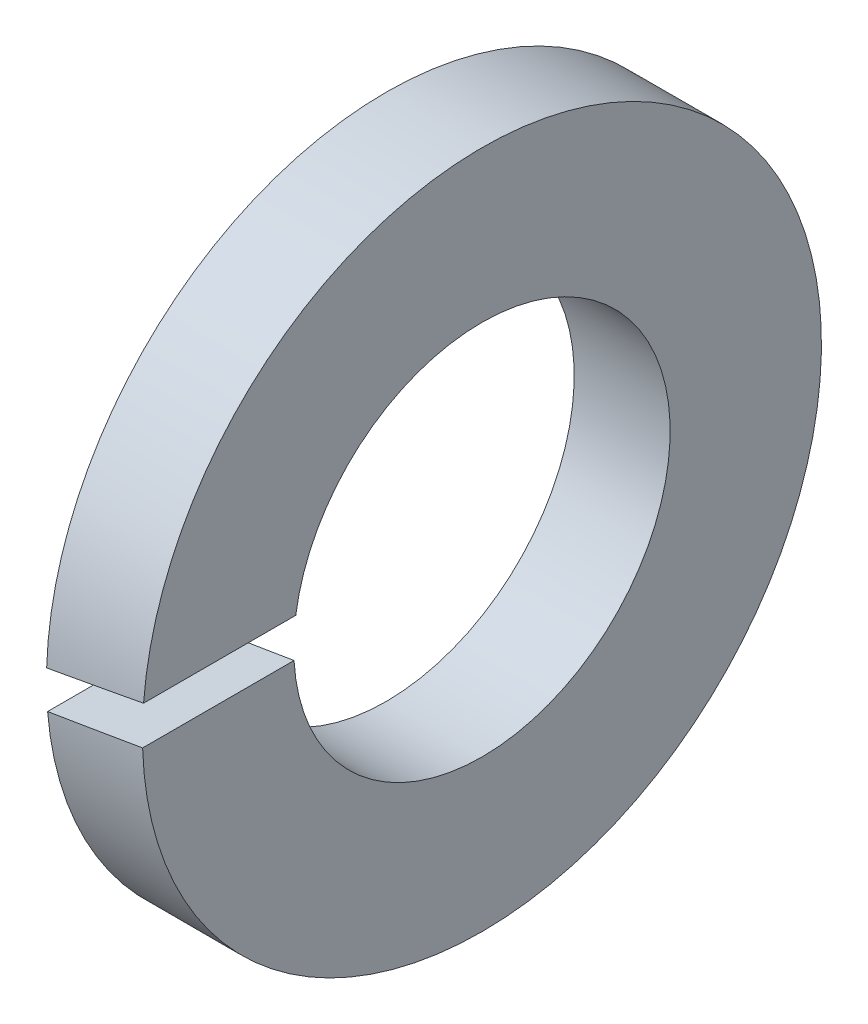
ISO-10303-21;
HEADER;
FILE_DESCRIPTION(('STEP AP214'),'2;1');
FILE_NAME('part.step','',(''),(''),'','','');
FILE_SCHEMA(('AUTOMOTIVE_DESIGN { 1 0 10303 214 1 1 1 1 }'));
ENDSEC;
DATA;
#1=APPLICATION_CONTEXT('core data for automotive mechanical design processes');
#2=APPLICATION_PROTOCOL_DEFINITION('international standard','automotive_design',2000,#1);
#3=PRODUCT_CONTEXT('',#1,'mechanical');
#4=PRODUCT('Part','Part','',(#3));
#5=PRODUCT_RELATED_PRODUCT_CATEGORY('part','',(#4));
#6=PRODUCT_DEFINITION_FORMATION('','',#4);
#7=PRODUCT_DEFINITION_CONTEXT('part definition',#1,'design');
#8=PRODUCT_DEFINITION('design','',#6,#7);
#9=PRODUCT_DEFINITION_SHAPE('','',#8);
#10=(LENGTH_UNIT() NAMED_UNIT(*) SI_UNIT(.MILLI.,.METRE.));
#11=(NAMED_UNIT(*) PLANE_ANGLE_UNIT() SI_UNIT($,.RADIAN.));
#12=(NAMED_UNIT(*) SI_UNIT($,.STERADIAN.) SOLID_ANGLE_UNIT());
#13=UNCERTAINTY_MEASURE_WITH_UNIT(LENGTH_MEASURE(1.E-05),#10,'distance_accuracy_value','');
#14=(GEOMETRIC_REPRESENTATION_CONTEXT(3) GLOBAL_UNCERTAINTY_ASSIGNED_CONTEXT((#13)) GLOBAL_UNIT_ASSIGNED_CONTEXT((#10,
#11,#12)) REPRESENTATION_CONTEXT('',''));
#15=CARTESIAN_POINT('',(0.,0.,0.));
#16=DIRECTION('',(0.,0.,1.));
#17=DIRECTION('',(1.,0.,0.));
#18=AXIS2_PLACEMENT_3D('',#15,#16,#17);
#19=CARTESIAN_POINT('',(-1.3,2.55,0.));
#20=DIRECTION('',(1.,0.,0.));
#21=DIRECTION('',(0.,0.,-1.));
#22=AXIS2_PLACEMENT_3D('',#19,#20,#21);
#23=PLANE('',#22);
#24=DIRECTION('',(0.,0.,-1.));
#25=VECTOR('',#24,1.);
#26=CARTESIAN_POINT('',(-1.3,-0.373546323491365,4.6));
#27=LINE('',#26,#25);
#28=CARTESIAN_POINT('',(-1.3,-0.373546323491365,4.58480786339036));
#29=VERTEX_POINT('',#28);
#30=CARTESIAN_POINT('',(-1.3,-0.373546323491365,2.52249145572509));
#31=VERTEX_POINT('',#30);
#32=EDGE_CURVE('E80',#29,#31,#27,.T.);
#33=ORIENTED_EDGE('',*,*,#32,.T.);
#34=CARTESIAN_POINT('',(-1.3,0.,0.));
#35=DIRECTION('',(-1.,0.,0.));
#36=DIRECTION('',(0.,0.,1.));
#37=AXIS2_PLACEMENT_3D('',#34,#35,#36);
#38=CIRCLE('',#37,2.55);
#39=CARTESIAN_POINT('',(-1.3,0.144321248570365,2.54591268059435));
#40=VERTEX_POINT('',#39);
#41=EDGE_CURVE('E88',#40,#31,#38,.T.);
#42=ORIENTED_EDGE('',*,*,#41,.F.);
#43=DIRECTION('',(0.,0.,-1.));
#44=VECTOR('',#43,1.);
#45=CARTESIAN_POINT('',(-1.3,0.144321248570365,4.6));
#46=LINE('',#45,#44);
#47=CARTESIAN_POINT('',(-1.3,0.144321248570365,4.59773546185631));
#48=VERTEX_POINT('',#47);
#49=EDGE_CURVE('E48',#48,#40,#46,.T.);
#50=ORIENTED_EDGE('',*,*,#49,.F.);
#51=CARTESIAN_POINT('',(-1.3,0.,0.));
#52=DIRECTION('',(-1.,0.,0.));
#53=DIRECTION('',(0.,0.,1.));
#54=AXIS2_PLACEMENT_3D('',#51,#52,#53);
#55=CIRCLE('',#54,4.6);
#56=EDGE_CURVE('E86',#48,#29,#55,.T.);
#57=ORIENTED_EDGE('',*,*,#56,.T.);
#58=EDGE_LOOP('',(#33,#42,#50,#57));
#59=FACE_BOUND('',#58,.T.);
#60=ADVANCED_FACE('F34',(#59),#23,.F.);
#61=CARTESIAN_POINT('',(-1.3,0.,0.));
#62=DIRECTION('',(-1.,0.,0.));
#63=DIRECTION('',(0.,0.,1.));
#64=AXIS2_PLACEMENT_3D('',#61,#62,#63);
#65=CYLINDRICAL_SURFACE('',#64,4.6);
#66=CARTESIAN_POINT('',(0.818486473201653,0.,0.));
#67=DIRECTION('',(-0.173648177666927,0.984807753012209,0.));
#68=DIRECTION('',(-0.984807753012209,-0.173648177666927,0.));
#69=AXIS2_PLACEMENT_3D('',#66,#67,#68);
#70=ELLIPSE('',#69,26.4903442224612,4.6);
#71=CARTESIAN_POINT('',(0.,-0.144321248570365,4.59773546185631));
#72=VERTEX_POINT('',#71);
#73=EDGE_CURVE('E79',#29,#72,#70,.T.);
#74=ORIENTED_EDGE('',*,*,#73,.F.);
#75=ORIENTED_EDGE('',*,*,#56,.F.);
#76=CARTESIAN_POINT('',(-2.11848647320165,0.,0.));
#77=DIRECTION('',(0.173648177666927,-0.984807753012209,0.));
#78=DIRECTION('',(-0.984807753012209,-0.173648177666927,0.));
#79=AXIS2_PLACEMENT_3D('',#76,#77,#78);
#80=ELLIPSE('',#79,26.4903442224612,4.6);
#81=CARTESIAN_POINT('',(0.,0.373546323491365,4.58480786339036));
#82=VERTEX_POINT('',#81);
#83=EDGE_CURVE('E71',#82,#48,#80,.T.);
#84=ORIENTED_EDGE('',*,*,#83,.F.);
#85=CARTESIAN_POINT('',(0.,0.,0.));
#86=DIRECTION('',(-1.,0.,0.));
#87=DIRECTION('',(0.,0.,1.));
#88=AXIS2_PLACEMENT_3D('',#85,#86,#87);
#89=CIRCLE('',#88,4.6);
#90=EDGE_CURVE('E92',#82,#72,#89,.T.);
#91=ORIENTED_EDGE('',*,*,#90,.T.);
#92=EDGE_LOOP('',(#74,#75,#84,#91));
#93=FACE_BOUND('',#92,.T.);
#94=ADVANCED_FACE('F91',(#93),#65,.T.);
#95=CARTESIAN_POINT('',(0.,2.55,0.));
#96=DIRECTION('',(-1.,0.,0.));
#97=DIRECTION('',(0.,0.,1.));
#98=AXIS2_PLACEMENT_3D('',#95,#96,#97);
#99=PLANE('',#98);
#100=DIRECTION('',(0.,0.,-1.));
#101=VECTOR('',#100,1.);
#102=CARTESIAN_POINT('',(0.,-0.144321248570365,4.6));
#103=LINE('',#102,#101);
#104=CARTESIAN_POINT('',(0.,-0.144321248570365,2.54591268059435));
#105=VERTEX_POINT('',#104);
#106=EDGE_CURVE('E55',#72,#105,#103,.T.);
#107=ORIENTED_EDGE('',*,*,#106,.F.);
#108=ORIENTED_EDGE('',*,*,#90,.F.);
#109=DIRECTION('',(0.,0.,-1.));
#110=VECTOR('',#109,1.);
#111=CARTESIAN_POINT('',(0.,0.373546323491365,4.6));
#112=LINE('',#111,#110);
#113=CARTESIAN_POINT('',(0.,0.373546323491365,2.52249145572509));
#114=VERTEX_POINT('',#113);
#115=EDGE_CURVE('E74',#82,#114,#112,.T.);
#116=ORIENTED_EDGE('',*,*,#115,.T.);
#117=CARTESIAN_POINT('',(0.,0.,0.));
#118=DIRECTION('',(-1.,0.,0.));
#119=DIRECTION('',(0.,0.,1.));
#120=AXIS2_PLACEMENT_3D('',#117,#118,#119);
#121=CIRCLE('',#120,2.55);
#122=EDGE_CURVE('E94',#114,#105,#121,.T.);
#123=ORIENTED_EDGE('',*,*,#122,.T.);
#124=EDGE_LOOP('',(#107,#108,#116,#123));
#125=FACE_BOUND('',#124,.T.);
#126=ADVANCED_FACE('F105',(#125),#99,.F.);
#127=CARTESIAN_POINT('',(-1.3,0.,0.));
#128=DIRECTION('',(-1.,0.,0.));
#129=DIRECTION('',(0.,0.,1.));
#130=AXIS2_PLACEMENT_3D('',#127,#128,#129);
#131=CYLINDRICAL_SURFACE('',#130,2.55);
#132=CARTESIAN_POINT('',(0.818486473201653,0.,0.));
#133=DIRECTION('',(-0.173648177666927,0.984807753012209,0.));
#134=DIRECTION('',(-0.984807753012209,-0.173648177666927,0.));
#135=AXIS2_PLACEMENT_3D('',#132,#133,#134);
#136=ELLIPSE('',#135,14.6848647320165,2.55);
#137=EDGE_CURVE('E11',#105,#31,#136,.F.);
#138=ORIENTED_EDGE('',*,*,#137,.F.);
#139=ORIENTED_EDGE('',*,*,#122,.F.);
#140=CARTESIAN_POINT('',(-2.11848647320165,0.,0.));
#141=DIRECTION('',(0.173648177666927,-0.984807753012209,0.));
#142=DIRECTION('',(-0.984807753012209,-0.173648177666927,0.));
#143=AXIS2_PLACEMENT_3D('',#140,#141,#142);
#144=ELLIPSE('',#143,14.6848647320165,2.55);
#145=EDGE_CURVE('E41',#40,#114,#144,.F.);
#146=ORIENTED_EDGE('',*,*,#145,.F.);
#147=ORIENTED_EDGE('',*,*,#41,.T.);
#148=EDGE_LOOP('',(#138,#139,#146,#147));
#149=FACE_BOUND('',#148,.T.);
#150=ADVANCED_FACE('F107',(#149),#131,.F.);
#151=CARTESIAN_POINT('',(-1.3,0.144321248570365,4.6));
#152=DIRECTION('',(0.173648177666927,-0.984807753012209,0.));
#153=DIRECTION('',(0.984807753012209,0.173648177666927,0.));
#154=AXIS2_PLACEMENT_3D('',#151,#152,#153);
#155=PLANE('',#154);
#156=ORIENTED_EDGE('',*,*,#83,.T.);
#157=ORIENTED_EDGE('',*,*,#49,.T.);
#158=ORIENTED_EDGE('',*,*,#145,.T.);
#159=ORIENTED_EDGE('',*,*,#115,.F.);
#160=EDGE_LOOP('',(#156,#157,#158,#159));
#161=FACE_BOUND('',#160,.T.);
#162=ADVANCED_FACE('F72',(#161),#155,.T.);
#163=CARTESIAN_POINT('',(0.,-0.144321248570365,4.6));
#164=DIRECTION('',(-0.173648177666927,0.984807753012209,0.));
#165=DIRECTION('',(-0.984807753012209,-0.173648177666927,0.));
#166=AXIS2_PLACEMENT_3D('',#163,#164,#165);
#167=PLANE('',#166);
#168=ORIENTED_EDGE('',*,*,#73,.T.);
#169=ORIENTED_EDGE('',*,*,#106,.T.);
#170=ORIENTED_EDGE('',*,*,#137,.T.);
#171=ORIENTED_EDGE('',*,*,#32,.F.);
#172=EDGE_LOOP('',(#168,#169,#170,#171));
#173=FACE_BOUND('',#172,.T.);
#174=ADVANCED_FACE('F108',(#173),#167,.T.);
#175=CLOSED_SHELL('',(#60,#94,#126,#150,#162,#174));
#176=MANIFOLD_SOLID_BREP('B2',#175);
#177=ADVANCED_BREP_SHAPE_REPRESENTATION('',(#18,#176),#14);
#178=SHAPE_DEFINITION_REPRESENTATION(#9,#177);
ENDSEC;
END-ISO-10303-21;
